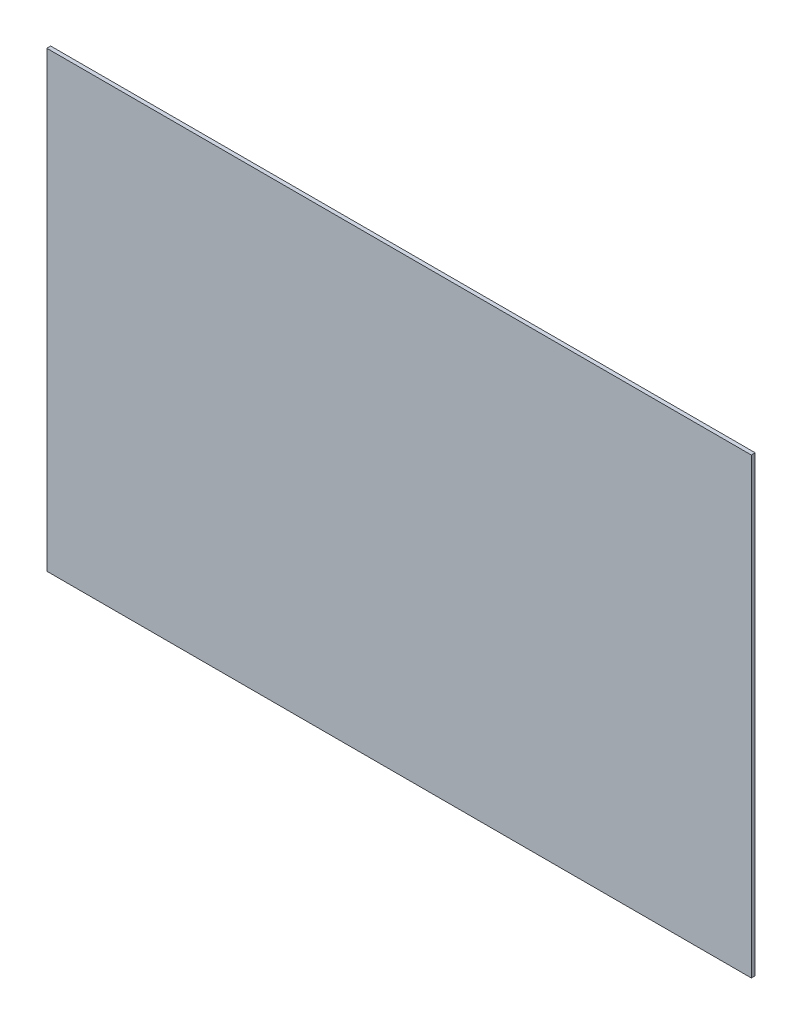
ISO-10303-21;
HEADER;
FILE_DESCRIPTION(('STEP AP214'),'2;1');
FILE_NAME('part.step','',(''),(''),'','','');
FILE_SCHEMA(('AUTOMOTIVE_DESIGN { 1 0 10303 214 1 1 1 1 }'));
ENDSEC;
DATA;
#1=APPLICATION_CONTEXT('core data for automotive mechanical design processes');
#2=APPLICATION_PROTOCOL_DEFINITION('international standard','automotive_design',2000,#1);
#3=PRODUCT_CONTEXT('',#1,'mechanical');
#4=PRODUCT('Part','Part','',(#3));
#5=PRODUCT_RELATED_PRODUCT_CATEGORY('part','',(#4));
#6=PRODUCT_DEFINITION_FORMATION('','',#4);
#7=PRODUCT_DEFINITION_CONTEXT('part definition',#1,'design');
#8=PRODUCT_DEFINITION('design','',#6,#7);
#9=PRODUCT_DEFINITION_SHAPE('','',#8);
#10=(LENGTH_UNIT() NAMED_UNIT(*) SI_UNIT(.MILLI.,.METRE.));
#11=(NAMED_UNIT(*) PLANE_ANGLE_UNIT() SI_UNIT($,.RADIAN.));
#12=(NAMED_UNIT(*) SI_UNIT($,.STERADIAN.) SOLID_ANGLE_UNIT());
#13=UNCERTAINTY_MEASURE_WITH_UNIT(LENGTH_MEASURE(1.E-05),#10,'distance_accuracy_value','');
#14=(GEOMETRIC_REPRESENTATION_CONTEXT(3) GLOBAL_UNCERTAINTY_ASSIGNED_CONTEXT((#13)) GLOBAL_UNIT_ASSIGNED_CONTEXT((#10,
#11,#12)) REPRESENTATION_CONTEXT('',''));
#15=CARTESIAN_POINT('',(0.,0.,0.));
#16=DIRECTION('',(0.,0.,1.));
#17=DIRECTION('',(1.,0.,0.));
#18=AXIS2_PLACEMENT_3D('',#15,#16,#17);
#19=CARTESIAN_POINT('',(91.,58.5,1.));
#20=DIRECTION('',(-1.,0.,0.));
#21=DIRECTION('',(0.,-1.,0.));
#22=AXIS2_PLACEMENT_3D('',#19,#20,#21);
#23=PLANE('',#22);
#24=DIRECTION('',(0.,1.,0.));
#25=VECTOR('',#24,1.);
#26=CARTESIAN_POINT('',(91.,58.5,0.));
#27=LINE('',#26,#25);
#28=CARTESIAN_POINT('',(91.,-58.5,0.));
#29=VERTEX_POINT('',#28);
#30=CARTESIAN_POINT('',(91.,58.5,0.));
#31=VERTEX_POINT('',#30);
#32=EDGE_CURVE('E98',#29,#31,#27,.T.);
#33=ORIENTED_EDGE('',*,*,#32,.T.);
#34=DIRECTION('',(0.,0.,-1.));
#35=VECTOR('',#34,1.);
#36=CARTESIAN_POINT('',(91.,58.5,1.));
#37=LINE('',#36,#35);
#38=CARTESIAN_POINT('',(91.,58.5,1.));
#39=VERTEX_POINT('',#38);
#40=EDGE_CURVE('E11',#39,#31,#37,.T.);
#41=ORIENTED_EDGE('',*,*,#40,.F.);
#42=DIRECTION('',(0.,1.,0.));
#43=VECTOR('',#42,1.);
#44=CARTESIAN_POINT('',(91.,58.5,1.));
#45=LINE('',#44,#43);
#46=CARTESIAN_POINT('',(91.,-58.5,1.));
#47=VERTEX_POINT('',#46);
#48=EDGE_CURVE('E86',#47,#39,#45,.T.);
#49=ORIENTED_EDGE('',*,*,#48,.F.);
#50=DIRECTION('',(0.,0.,-1.));
#51=VECTOR('',#50,1.);
#52=CARTESIAN_POINT('',(91.,-58.5,1.));
#53=LINE('',#52,#51);
#54=EDGE_CURVE('E94',#47,#29,#53,.T.);
#55=ORIENTED_EDGE('',*,*,#54,.T.);
#56=EDGE_LOOP('',(#33,#41,#49,#55));
#57=FACE_BOUND('',#56,.T.);
#58=ADVANCED_FACE('F35',(#57),#23,.F.);
#59=CARTESIAN_POINT('',(-91.,58.5,1.));
#60=DIRECTION('',(0.,-1.,0.));
#61=DIRECTION('',(0.,0.,-1.));
#62=AXIS2_PLACEMENT_3D('',#59,#60,#61);
#63=PLANE('',#62);
#64=DIRECTION('',(-1.,0.,0.));
#65=VECTOR('',#64,1.);
#66=CARTESIAN_POINT('',(-91.,58.5,0.));
#67=LINE('',#66,#65);
#68=CARTESIAN_POINT('',(-91.,58.5,0.));
#69=VERTEX_POINT('',#68);
#70=EDGE_CURVE('E90',#31,#69,#67,.T.);
#71=ORIENTED_EDGE('',*,*,#70,.T.);
#72=DIRECTION('',(0.,0.,-1.));
#73=VECTOR('',#72,1.);
#74=CARTESIAN_POINT('',(-91.,58.5,1.));
#75=LINE('',#74,#73);
#76=CARTESIAN_POINT('',(-91.,58.5,1.));
#77=VERTEX_POINT('',#76);
#78=EDGE_CURVE('E43',#77,#69,#75,.T.);
#79=ORIENTED_EDGE('',*,*,#78,.F.);
#80=DIRECTION('',(-1.,0.,0.));
#81=VECTOR('',#80,1.);
#82=CARTESIAN_POINT('',(-91.,58.5,1.));
#83=LINE('',#82,#81);
#84=EDGE_CURVE('E81',#39,#77,#83,.T.);
#85=ORIENTED_EDGE('',*,*,#84,.F.);
#86=ORIENTED_EDGE('',*,*,#40,.T.);
#87=EDGE_LOOP('',(#71,#79,#85,#86));
#88=FACE_BOUND('',#87,.T.);
#89=ADVANCED_FACE('F89',(#88),#63,.F.);
#90=CARTESIAN_POINT('',(-91.,58.5,1.));
#91=DIRECTION('',(1.,0.,0.));
#92=DIRECTION('',(0.,1.,0.));
#93=AXIS2_PLACEMENT_3D('',#90,#91,#92);
#94=PLANE('',#93);
#95=DIRECTION('',(0.,-1.,0.));
#96=VECTOR('',#95,1.);
#97=CARTESIAN_POINT('',(-91.,58.5,0.));
#98=LINE('',#97,#96);
#99=CARTESIAN_POINT('',(-91.,-58.5,0.));
#100=VERTEX_POINT('',#99);
#101=EDGE_CURVE('E68',#69,#100,#98,.T.);
#102=ORIENTED_EDGE('',*,*,#101,.T.);
#103=DIRECTION('',(0.,0.,-1.));
#104=VECTOR('',#103,1.);
#105=CARTESIAN_POINT('',(-91.,-58.5,1.));
#106=LINE('',#105,#104);
#107=CARTESIAN_POINT('',(-91.,-58.5,1.));
#108=VERTEX_POINT('',#107);
#109=EDGE_CURVE('E91',#108,#100,#106,.T.);
#110=ORIENTED_EDGE('',*,*,#109,.F.);
#111=DIRECTION('',(0.,-1.,0.));
#112=VECTOR('',#111,1.);
#113=CARTESIAN_POINT('',(-91.,58.5,1.));
#114=LINE('',#113,#112);
#115=EDGE_CURVE('E84',#77,#108,#114,.T.);
#116=ORIENTED_EDGE('',*,*,#115,.F.);
#117=ORIENTED_EDGE('',*,*,#78,.T.);
#118=EDGE_LOOP('',(#102,#110,#116,#117));
#119=FACE_BOUND('',#118,.T.);
#120=ADVANCED_FACE('F92',(#119),#94,.F.);
#121=CARTESIAN_POINT('',(-91.,-58.5,1.));
#122=DIRECTION('',(0.,1.,0.));
#123=DIRECTION('',(0.,0.,1.));
#124=AXIS2_PLACEMENT_3D('',#121,#122,#123);
#125=PLANE('',#124);
#126=DIRECTION('',(1.,0.,0.));
#127=VECTOR('',#126,1.);
#128=CARTESIAN_POINT('',(-91.,-58.5,0.));
#129=LINE('',#128,#127);
#130=EDGE_CURVE('E74',#100,#29,#129,.T.);
#131=ORIENTED_EDGE('',*,*,#130,.T.);
#132=ORIENTED_EDGE('',*,*,#54,.F.);
#133=DIRECTION('',(1.,0.,0.));
#134=VECTOR('',#133,1.);
#135=CARTESIAN_POINT('',(-91.,-58.5,1.));
#136=LINE('',#135,#134);
#137=EDGE_CURVE('E51',#108,#47,#136,.T.);
#138=ORIENTED_EDGE('',*,*,#137,.F.);
#139=ORIENTED_EDGE('',*,*,#109,.T.);
#140=EDGE_LOOP('',(#131,#132,#138,#139));
#141=FACE_BOUND('',#140,.T.);
#142=ADVANCED_FACE('F105',(#141),#125,.F.);
#143=CARTESIAN_POINT('',(0.,0.,1.));
#144=DIRECTION('',(0.,0.,1.));
#145=DIRECTION('',(1.,0.,0.));
#146=AXIS2_PLACEMENT_3D('',#143,#144,#145);
#147=PLANE('',#146);
#148=ORIENTED_EDGE('',*,*,#48,.T.);
#149=ORIENTED_EDGE('',*,*,#84,.T.);
#150=ORIENTED_EDGE('',*,*,#115,.T.);
#151=ORIENTED_EDGE('',*,*,#137,.T.);
#152=EDGE_LOOP('',(#148,#149,#150,#151));
#153=FACE_BOUND('',#152,.T.);
#154=ADVANCED_FACE('F82',(#153),#147,.T.);
#155=CARTESIAN_POINT('',(0.,0.,0.));
#156=DIRECTION('',(0.,0.,1.));
#157=DIRECTION('',(1.,0.,0.));
#158=AXIS2_PLACEMENT_3D('',#155,#156,#157);
#159=PLANE('',#158);
#160=ORIENTED_EDGE('',*,*,#32,.F.);
#161=ORIENTED_EDGE('',*,*,#130,.F.);
#162=ORIENTED_EDGE('',*,*,#101,.F.);
#163=ORIENTED_EDGE('',*,*,#70,.F.);
#164=EDGE_LOOP('',(#160,#161,#162,#163));
#165=FACE_BOUND('',#164,.T.);
#166=ADVANCED_FACE('F108',(#165),#159,.F.);
#167=CLOSED_SHELL('',(#58,#89,#120,#142,#154,#166));
#168=MANIFOLD_SOLID_BREP('B2',#167);
#169=ADVANCED_BREP_SHAPE_REPRESENTATION('',(#18,#168),#14);
#170=SHAPE_DEFINITION_REPRESENTATION(#9,#169);
ENDSEC;
END-ISO-10303-21;
